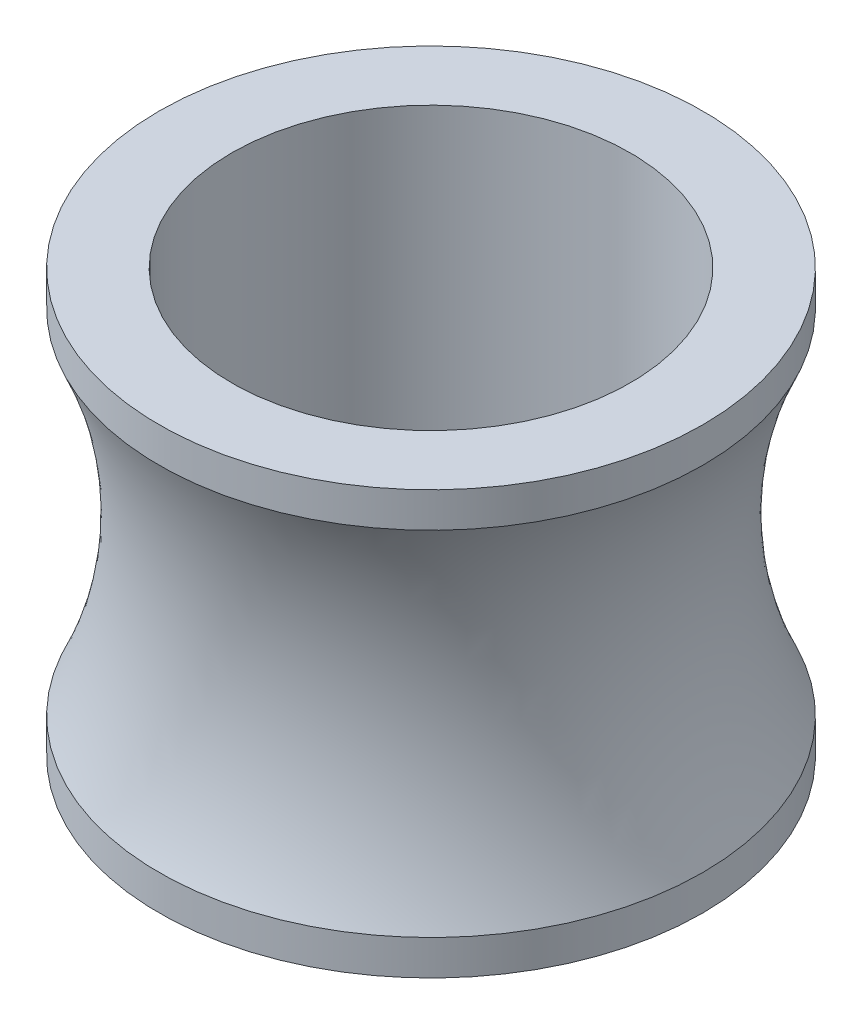
ISO-10303-21;
HEADER;
FILE_DESCRIPTION(('STEP AP214'),'2;1');
FILE_NAME('part.step','',(''),(''),'','','');
FILE_SCHEMA(('AUTOMOTIVE_DESIGN { 1 0 10303 214 1 1 1 1 }'));
ENDSEC;
DATA;
#1=APPLICATION_CONTEXT('core data for automotive mechanical design processes');
#2=APPLICATION_PROTOCOL_DEFINITION('international standard','automotive_design',2000,#1);
#3=PRODUCT_CONTEXT('',#1,'mechanical');
#4=PRODUCT('Part','Part','',(#3));
#5=PRODUCT_RELATED_PRODUCT_CATEGORY('part','',(#4));
#6=PRODUCT_DEFINITION_FORMATION('','',#4);
#7=PRODUCT_DEFINITION_CONTEXT('part definition',#1,'design');
#8=PRODUCT_DEFINITION('design','',#6,#7);
#9=PRODUCT_DEFINITION_SHAPE('','',#8);
#10=(LENGTH_UNIT() NAMED_UNIT(*) SI_UNIT(.MILLI.,.METRE.));
#11=(NAMED_UNIT(*) PLANE_ANGLE_UNIT() SI_UNIT($,.RADIAN.));
#12=(NAMED_UNIT(*) SI_UNIT($,.STERADIAN.) SOLID_ANGLE_UNIT());
#13=UNCERTAINTY_MEASURE_WITH_UNIT(LENGTH_MEASURE(1.E-05),#10,'distance_accuracy_value','');
#14=(GEOMETRIC_REPRESENTATION_CONTEXT(3) GLOBAL_UNCERTAINTY_ASSIGNED_CONTEXT((#13)) GLOBAL_UNIT_ASSIGNED_CONTEXT((#10,
#11,#12)) REPRESENTATION_CONTEXT('',''));
#15=CARTESIAN_POINT('',(0.,0.,0.));
#16=DIRECTION('',(0.,0.,1.));
#17=DIRECTION('',(1.,0.,0.));
#18=AXIS2_PLACEMENT_3D('',#15,#16,#17);
#19=CARTESIAN_POINT('',(0.,35.,0.));
#20=DIRECTION('',(0.,1.,0.));
#21=DIRECTION('',(-1.,0.,0.));
#22=AXIS2_PLACEMENT_3D('',#19,#20,#21);
#23=CYLINDRICAL_SURFACE('',#22,45.);
#24=CARTESIAN_POINT('',(0.,35.,0.));
#25=DIRECTION('',(0.,1.,0.));
#26=DIRECTION('',(-1.,0.,0.));
#27=AXIS2_PLACEMENT_3D('',#24,#25,#26);
#28=CIRCLE('',#27,45.);
#29=CARTESIAN_POINT('',(-45.,35.,0.));
#30=VERTEX_POINT('',#29);
#31=EDGE_CURVE('E10',#30,#30,#28,.T.);
#32=ORIENTED_EDGE('',*,*,#31,.F.);
#33=EDGE_LOOP('',(#32));
#34=FACE_BOUND('',#33,.T.);
#35=CARTESIAN_POINT('',(0.,29.1936522280193,0.));
#36=DIRECTION('',(0.,1.,0.));
#37=DIRECTION('',(-1.,0.,0.));
#38=AXIS2_PLACEMENT_3D('',#35,#36,#37);
#39=CIRCLE('',#38,45.);
#40=CARTESIAN_POINT('',(-45.,29.1936522280193,0.));
#41=VERTEX_POINT('',#40);
#42=EDGE_CURVE('E52',#41,#41,#39,.T.);
#43=ORIENTED_EDGE('',*,*,#42,.T.);
#44=EDGE_LOOP('',(#43));
#45=FACE_BOUND('',#44,.T.);
#46=ADVANCED_FACE('F30',(#34,#45),#23,.T.);
#47=CARTESIAN_POINT('',(33.,35.,0.));
#48=DIRECTION('',(0.,-1.,0.));
#49=DIRECTION('',(1.,0.,0.));
#50=AXIS2_PLACEMENT_3D('',#47,#48,#49);
#51=PLANE('',#50);
#52=CARTESIAN_POINT('',(0.,35.,0.));
#53=DIRECTION('',(0.,1.,0.));
#54=DIRECTION('',(-1.,0.,0.));
#55=AXIS2_PLACEMENT_3D('',#52,#53,#54);
#56=CIRCLE('',#55,33.);
#57=CARTESIAN_POINT('',(-33.,35.,0.));
#58=VERTEX_POINT('',#57);
#59=EDGE_CURVE('E36',#58,#58,#56,.T.);
#60=ORIENTED_EDGE('',*,*,#59,.F.);
#61=EDGE_LOOP('',(#60));
#62=FACE_BOUND('',#61,.T.);
#63=ORIENTED_EDGE('',*,*,#31,.T.);
#64=EDGE_LOOP('',(#63));
#65=FACE_BOUND('',#64,.T.);
#66=ADVANCED_FACE('F77',(#62,#65),#51,.F.);
#67=CARTESIAN_POINT('',(0.,35.,0.));
#68=DIRECTION('',(0.,1.,0.));
#69=DIRECTION('',(-1.,0.,0.));
#70=AXIS2_PLACEMENT_3D('',#67,#68,#69);
#71=CYLINDRICAL_SURFACE('',#70,33.);
#72=CARTESIAN_POINT('',(0.,-35.,0.));
#73=DIRECTION('',(0.,1.,0.));
#74=DIRECTION('',(-1.,0.,0.));
#75=AXIS2_PLACEMENT_3D('',#72,#73,#74);
#76=CIRCLE('',#75,33.);
#77=CARTESIAN_POINT('',(-33.,-35.,0.));
#78=VERTEX_POINT('',#77);
#79=EDGE_CURVE('E40',#78,#78,#76,.T.);
#80=ORIENTED_EDGE('',*,*,#79,.F.);
#81=EDGE_LOOP('',(#80));
#82=FACE_BOUND('',#81,.T.);
#83=ORIENTED_EDGE('',*,*,#59,.T.);
#84=EDGE_LOOP('',(#83));
#85=FACE_BOUND('',#84,.T.);
#86=ADVANCED_FACE('F72',(#82,#85),#71,.F.);
#87=CARTESIAN_POINT('',(33.,-35.,0.));
#88=DIRECTION('',(0.,1.,0.));
#89=DIRECTION('',(-1.,0.,0.));
#90=AXIS2_PLACEMENT_3D('',#87,#88,#89);
#91=PLANE('',#90);
#92=CARTESIAN_POINT('',(0.,-35.,0.));
#93=DIRECTION('',(0.,1.,0.));
#94=DIRECTION('',(-1.,0.,0.));
#95=AXIS2_PLACEMENT_3D('',#92,#93,#94);
#96=CIRCLE('',#95,45.);
#97=CARTESIAN_POINT('',(-45.,-35.,0.));
#98=VERTEX_POINT('',#97);
#99=EDGE_CURVE('E44',#98,#98,#96,.T.);
#100=ORIENTED_EDGE('',*,*,#99,.F.);
#101=EDGE_LOOP('',(#100));
#102=FACE_BOUND('',#101,.T.);
#103=ORIENTED_EDGE('',*,*,#79,.T.);
#104=EDGE_LOOP('',(#103));
#105=FACE_BOUND('',#104,.T.);
#106=ADVANCED_FACE('F66',(#102,#105),#91,.F.);
#107=CARTESIAN_POINT('',(0.,35.,0.));
#108=DIRECTION('',(0.,1.,0.));
#109=DIRECTION('',(-1.,0.,0.));
#110=AXIS2_PLACEMENT_3D('',#107,#108,#109);
#111=CYLINDRICAL_SURFACE('',#110,45.);
#112=CARTESIAN_POINT('',(0.,-29.1936522280193,0.));
#113=DIRECTION('',(0.,1.,0.));
#114=DIRECTION('',(-1.,0.,0.));
#115=AXIS2_PLACEMENT_3D('',#112,#113,#114);
#116=CIRCLE('',#115,45.);
#117=CARTESIAN_POINT('',(-45.,-29.1936522280193,0.));
#118=VERTEX_POINT('',#117);
#119=EDGE_CURVE('E49',#118,#118,#116,.T.);
#120=ORIENTED_EDGE('',*,*,#119,.F.);
#121=EDGE_LOOP('',(#120));
#122=FACE_BOUND('',#121,.T.);
#123=ORIENTED_EDGE('',*,*,#99,.T.);
#124=EDGE_LOOP('',(#123));
#125=FACE_BOUND('',#124,.T.);
#126=ADVANCED_FACE('F60',(#122,#125),#111,.T.);
#127=CARTESIAN_POINT('',(0.,0.,0.));
#128=DIRECTION('',(0.,1.,0.));
#129=DIRECTION('',(-1.,0.,0.));
#130=AXIS2_PLACEMENT_3D('',#127,#128,#129);
#131=TOROIDAL_SURFACE('',#130,108.621778264911,70.);
#132=ORIENTED_EDGE('',*,*,#42,.F.);
#133=EDGE_LOOP('',(#132));
#134=FACE_BOUND('',#133,.T.);
#135=ORIENTED_EDGE('',*,*,#119,.T.);
#136=EDGE_LOOP('',(#135));
#137=FACE_BOUND('',#136,.T.);
#138=ADVANCED_FACE('F57',(#134,#137),#131,.F.);
#139=CLOSED_SHELL('',(#46,#66,#86,#106,#126,#138));
#140=MANIFOLD_SOLID_BREP('B2',#139);
#141=ADVANCED_BREP_SHAPE_REPRESENTATION('',(#18,#140),#14);
#142=SHAPE_DEFINITION_REPRESENTATION(#9,#141);
ENDSEC;
END-ISO-10303-21;
